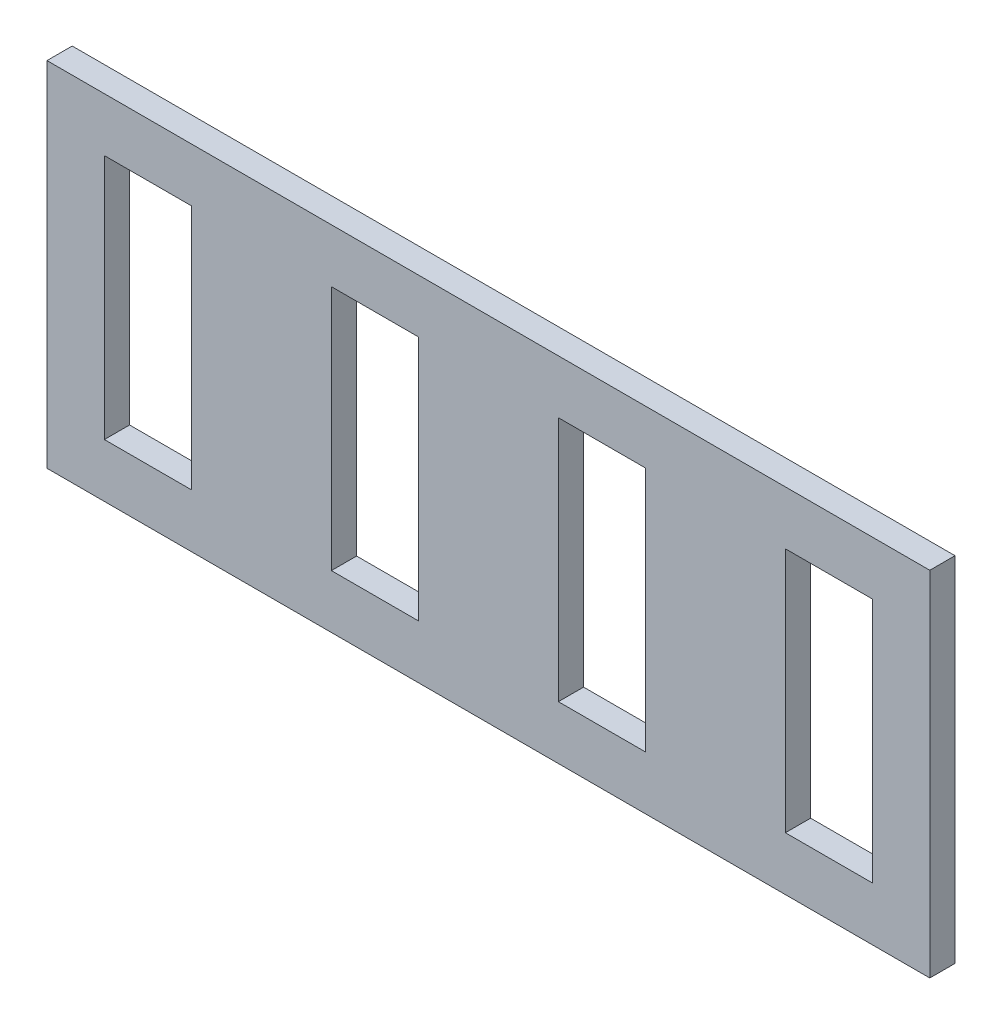
ISO-10303-21;
HEADER;
FILE_DESCRIPTION(('STEP AP214'),'2;1');
FILE_NAME('part.step','',(''),(''),'','','');
FILE_SCHEMA(('AUTOMOTIVE_DESIGN { 1 0 10303 214 1 1 1 1 }'));
ENDSEC;
DATA;
#1=APPLICATION_CONTEXT('core data for automotive mechanical design processes');
#2=APPLICATION_PROTOCOL_DEFINITION('international standard','automotive_design',2000,#1);
#3=PRODUCT_CONTEXT('',#1,'mechanical');
#4=PRODUCT('Part','Part','',(#3));
#5=PRODUCT_RELATED_PRODUCT_CATEGORY('part','',(#4));
#6=PRODUCT_DEFINITION_FORMATION('','',#4);
#7=PRODUCT_DEFINITION_CONTEXT('part definition',#1,'design');
#8=PRODUCT_DEFINITION('design','',#6,#7);
#9=PRODUCT_DEFINITION_SHAPE('','',#8);
#10=(LENGTH_UNIT() NAMED_UNIT(*) SI_UNIT(.MILLI.,.METRE.));
#11=(NAMED_UNIT(*) PLANE_ANGLE_UNIT() SI_UNIT($,.RADIAN.));
#12=(NAMED_UNIT(*) SI_UNIT($,.STERADIAN.) SOLID_ANGLE_UNIT());
#13=UNCERTAINTY_MEASURE_WITH_UNIT(LENGTH_MEASURE(1.E-05),#10,'distance_accuracy_value','');
#14=(GEOMETRIC_REPRESENTATION_CONTEXT(3) GLOBAL_UNCERTAINTY_ASSIGNED_CONTEXT((#13)) GLOBAL_UNIT_ASSIGNED_CONTEXT((#10,
#11,#12)) REPRESENTATION_CONTEXT('',''));
#15=CARTESIAN_POINT('',(0.,0.,0.));
#16=DIRECTION('',(0.,0.,1.));
#17=DIRECTION('',(1.,0.,0.));
#18=AXIS2_PLACEMENT_3D('',#15,#16,#17);
#19=CARTESIAN_POINT('',(0.,0.,20.));
#20=DIRECTION('',(0.,0.,-1.));
#21=DIRECTION('',(-1.,0.,0.));
#22=AXIS2_PLACEMENT_3D('',#19,#20,#21);
#23=PLANE('',#22);
#24=DIRECTION('',(1.,0.,0.));
#25=VECTOR('',#24,1.);
#26=CARTESIAN_POINT('',(130.5,-97.4999999999999,20.));
#27=LINE('',#26,#25);
#28=CARTESIAN_POINT('',(130.5,-97.4999999999999,20.));
#29=VERTEX_POINT('',#28);
#30=CARTESIAN_POINT('',(199.5,-97.4999999999999,20.));
#31=VERTEX_POINT('',#30);
#32=EDGE_CURVE('E216',#29,#31,#27,.T.);
#33=ORIENTED_EDGE('',*,*,#32,.F.);
#34=DIRECTION('',(0.,-1.,0.));
#35=VECTOR('',#34,1.);
#36=CARTESIAN_POINT('',(130.5,97.5000000000001,20.));
#37=LINE('',#36,#35);
#38=CARTESIAN_POINT('',(130.5,97.5000000000001,20.));
#39=VERTEX_POINT('',#38);
#40=EDGE_CURVE('E224',#39,#29,#37,.T.);
#41=ORIENTED_EDGE('',*,*,#40,.F.);
#42=DIRECTION('',(-1.,0.,0.));
#43=VECTOR('',#42,1.);
#44=CARTESIAN_POINT('',(130.5,97.5000000000001,20.));
#45=LINE('',#44,#43);
#46=CARTESIAN_POINT('',(199.5,97.5000000000001,20.));
#47=VERTEX_POINT('',#46);
#48=EDGE_CURVE('E221',#47,#39,#45,.T.);
#49=ORIENTED_EDGE('',*,*,#48,.F.);
#50=DIRECTION('',(0.,1.,0.));
#51=VECTOR('',#50,1.);
#52=CARTESIAN_POINT('',(199.5,97.5000000000001,20.));
#53=LINE('',#52,#51);
#54=EDGE_CURVE('E218',#31,#47,#53,.T.);
#55=ORIENTED_EDGE('',*,*,#54,.F.);
#56=EDGE_LOOP('',(#33,#41,#49,#55));
#57=FACE_BOUND('',#56,.T.);
#58=DIRECTION('',(0.,1.,0.));
#59=VECTOR('',#58,1.);
#60=CARTESIAN_POINT('',(-340.5,97.4999999999999,20.));
#61=LINE('',#60,#59);
#62=CARTESIAN_POINT('',(-340.5,-97.5000000000002,20.));
#63=VERTEX_POINT('',#62);
#64=CARTESIAN_POINT('',(-340.5,97.4999999999999,20.));
#65=VERTEX_POINT('',#64);
#66=EDGE_CURVE('E278',#63,#65,#61,.T.);
#67=ORIENTED_EDGE('',*,*,#66,.F.);
#68=DIRECTION('',(1.,0.,0.));
#69=VECTOR('',#68,1.);
#70=CARTESIAN_POINT('',(-409.5,-97.5000000000002,20.));
#71=LINE('',#70,#69);
#72=CARTESIAN_POINT('',(-409.5,-97.5000000000002,20.));
#73=VERTEX_POINT('',#72);
#74=EDGE_CURVE('E286',#73,#63,#71,.T.);
#75=ORIENTED_EDGE('',*,*,#74,.F.);
#76=DIRECTION('',(0.,-1.,0.));
#77=VECTOR('',#76,1.);
#78=CARTESIAN_POINT('',(-409.5,97.4999999999998,20.));
#79=LINE('',#78,#77);
#80=CARTESIAN_POINT('',(-409.5,97.4999999999998,20.));
#81=VERTEX_POINT('',#80);
#82=EDGE_CURVE('E283',#81,#73,#79,.T.);
#83=ORIENTED_EDGE('',*,*,#82,.F.);
#84=DIRECTION('',(-1.,0.,0.));
#85=VECTOR('',#84,1.);
#86=CARTESIAN_POINT('',(-409.5,97.4999999999998,20.));
#87=LINE('',#86,#85);
#88=EDGE_CURVE('E280',#65,#81,#87,.T.);
#89=ORIENTED_EDGE('',*,*,#88,.F.);
#90=EDGE_LOOP('',(#67,#75,#83,#89));
#91=FACE_BOUND('',#90,.T.);
#92=DIRECTION('',(0.,-1.,0.));
#93=VECTOR('',#92,1.);
#94=CARTESIAN_POINT('',(-455.,-140.,20.));
#95=LINE('',#94,#93);
#96=CARTESIAN_POINT('',(-455.,140.,20.));
#97=VERTEX_POINT('',#96);
#98=CARTESIAN_POINT('',(-455.,-140.,20.));
#99=VERTEX_POINT('',#98);
#100=EDGE_CURVE('E309',#97,#99,#95,.T.);
#101=ORIENTED_EDGE('',*,*,#100,.T.);
#102=DIRECTION('',(1.,0.,0.));
#103=VECTOR('',#102,1.);
#104=CARTESIAN_POINT('',(245.,-140.,20.));
#105=LINE('',#104,#103);
#106=CARTESIAN_POINT('',(245.,-140.,20.));
#107=VERTEX_POINT('',#106);
#108=EDGE_CURVE('E312',#99,#107,#105,.T.);
#109=ORIENTED_EDGE('',*,*,#108,.T.);
#110=DIRECTION('',(0.,1.,0.));
#111=VECTOR('',#110,1.);
#112=CARTESIAN_POINT('',(245.,140.,20.));
#113=LINE('',#112,#111);
#114=CARTESIAN_POINT('',(245.,140.,20.));
#115=VERTEX_POINT('',#114);
#116=EDGE_CURVE('E315',#107,#115,#113,.T.);
#117=ORIENTED_EDGE('',*,*,#116,.T.);
#118=DIRECTION('',(-1.,0.,0.));
#119=VECTOR('',#118,1.);
#120=CARTESIAN_POINT('',(-455.,140.,20.));
#121=LINE('',#120,#119);
#122=EDGE_CURVE('E317',#115,#97,#121,.T.);
#123=ORIENTED_EDGE('',*,*,#122,.T.);
#124=EDGE_LOOP('',(#101,#109,#117,#123));
#125=FACE_BOUND('',#124,.T.);
#126=DIRECTION('',(1.,0.,0.));
#127=VECTOR('',#126,1.);
#128=CARTESIAN_POINT('',(-229.5,-97.4999999999999,20.));
#129=LINE('',#128,#127);
#130=CARTESIAN_POINT('',(-229.5,-97.4999999999999,20.));
#131=VERTEX_POINT('',#130);
#132=CARTESIAN_POINT('',(-160.5,-97.4999999999999,20.));
#133=VERTEX_POINT('',#132);
#134=EDGE_CURVE('E247',#131,#133,#129,.T.);
#135=ORIENTED_EDGE('',*,*,#134,.F.);
#136=DIRECTION('',(0.,-1.,0.));
#137=VECTOR('',#136,1.);
#138=CARTESIAN_POINT('',(-229.5,97.5000000000001,20.));
#139=LINE('',#138,#137);
#140=CARTESIAN_POINT('',(-229.5,97.5000000000001,20.));
#141=VERTEX_POINT('',#140);
#142=EDGE_CURVE('E255',#141,#131,#139,.T.);
#143=ORIENTED_EDGE('',*,*,#142,.F.);
#144=DIRECTION('',(-1.,0.,0.));
#145=VECTOR('',#144,1.);
#146=CARTESIAN_POINT('',(-229.5,97.5000000000001,20.));
#147=LINE('',#146,#145);
#148=CARTESIAN_POINT('',(-160.5,97.5000000000001,20.));
#149=VERTEX_POINT('',#148);
#150=EDGE_CURVE('E252',#149,#141,#147,.T.);
#151=ORIENTED_EDGE('',*,*,#150,.F.);
#152=DIRECTION('',(0.,1.,0.));
#153=VECTOR('',#152,1.);
#154=CARTESIAN_POINT('',(-160.5,97.5000000000001,20.));
#155=LINE('',#154,#153);
#156=EDGE_CURVE('E249',#133,#149,#155,.T.);
#157=ORIENTED_EDGE('',*,*,#156,.F.);
#158=EDGE_LOOP('',(#135,#143,#151,#157));
#159=FACE_BOUND('',#158,.T.);
#160=DIRECTION('',(1.,0.,0.));
#161=VECTOR('',#160,1.);
#162=CARTESIAN_POINT('',(-49.5,-97.4999999999999,20.));
#163=LINE('',#162,#161);
#164=CARTESIAN_POINT('',(-49.5,-97.4999999999999,20.));
#165=VERTEX_POINT('',#164);
#166=CARTESIAN_POINT('',(19.5,-97.4999999999999,20.));
#167=VERTEX_POINT('',#166);
#168=EDGE_CURVE('E180',#165,#167,#163,.T.);
#169=ORIENTED_EDGE('',*,*,#168,.F.);
#170=DIRECTION('',(0.,-1.,0.));
#171=VECTOR('',#170,1.);
#172=CARTESIAN_POINT('',(-49.5,97.5000000000001,20.));
#173=LINE('',#172,#171);
#174=CARTESIAN_POINT('',(-49.5,97.5000000000001,20.));
#175=VERTEX_POINT('',#174);
#176=EDGE_CURVE('E202',#175,#165,#173,.T.);
#177=ORIENTED_EDGE('',*,*,#176,.F.);
#178=DIRECTION('',(-1.,0.,0.));
#179=VECTOR('',#178,1.);
#180=CARTESIAN_POINT('',(-49.5,97.5000000000001,20.));
#181=LINE('',#180,#179);
#182=CARTESIAN_POINT('',(19.5,97.5000000000001,20.));
#183=VERTEX_POINT('',#182);
#184=EDGE_CURVE('E200',#183,#175,#181,.T.);
#185=ORIENTED_EDGE('',*,*,#184,.F.);
#186=DIRECTION('',(0.,1.,0.));
#187=VECTOR('',#186,1.);
#188=CARTESIAN_POINT('',(19.5,97.5000000000001,20.));
#189=LINE('',#188,#187);
#190=EDGE_CURVE('E188',#167,#183,#189,.T.);
#191=ORIENTED_EDGE('',*,*,#190,.F.);
#192=EDGE_LOOP('',(#169,#177,#185,#191));
#193=FACE_BOUND('',#192,.T.);
#194=ADVANCED_FACE('F43',(#57,#91,#125,#159,#193),#23,.F.);
#195=CARTESIAN_POINT('',(0.,0.,0.));
#196=DIRECTION('',(0.,0.,-1.));
#197=DIRECTION('',(-1.,0.,0.));
#198=AXIS2_PLACEMENT_3D('',#195,#196,#197);
#199=PLANE('',#198);
#200=DIRECTION('',(0.,-1.,0.));
#201=VECTOR('',#200,1.);
#202=CARTESIAN_POINT('',(-455.,-140.,0.));
#203=LINE('',#202,#201);
#204=CARTESIAN_POINT('',(-455.,140.,0.));
#205=VERTEX_POINT('',#204);
#206=CARTESIAN_POINT('',(-455.,-140.,0.));
#207=VERTEX_POINT('',#206);
#208=EDGE_CURVE('E308',#205,#207,#203,.T.);
#209=ORIENTED_EDGE('',*,*,#208,.F.);
#210=DIRECTION('',(-1.,0.,0.));
#211=VECTOR('',#210,1.);
#212=CARTESIAN_POINT('',(-455.,140.,0.));
#213=LINE('',#212,#211);
#214=CARTESIAN_POINT('',(245.,140.,0.));
#215=VERTEX_POINT('',#214);
#216=EDGE_CURVE('E313',#215,#205,#213,.T.);
#217=ORIENTED_EDGE('',*,*,#216,.F.);
#218=DIRECTION('',(0.,1.,0.));
#219=VECTOR('',#218,1.);
#220=CARTESIAN_POINT('',(245.,140.,0.));
#221=LINE('',#220,#219);
#222=CARTESIAN_POINT('',(245.,-140.,0.));
#223=VERTEX_POINT('',#222);
#224=EDGE_CURVE('E324',#223,#215,#221,.T.);
#225=ORIENTED_EDGE('',*,*,#224,.F.);
#226=DIRECTION('',(1.,0.,0.));
#227=VECTOR('',#226,1.);
#228=CARTESIAN_POINT('',(245.,-140.,0.));
#229=LINE('',#228,#227);
#230=EDGE_CURVE('E322',#207,#223,#229,.T.);
#231=ORIENTED_EDGE('',*,*,#230,.F.);
#232=EDGE_LOOP('',(#209,#217,#225,#231));
#233=FACE_BOUND('',#232,.T.);
#234=DIRECTION('',(1.,0.,0.));
#235=VECTOR('',#234,1.);
#236=CARTESIAN_POINT('',(-409.5,-97.5000000000002,0.));
#237=LINE('',#236,#235);
#238=CARTESIAN_POINT('',(-409.5,-97.5000000000002,0.));
#239=VERTEX_POINT('',#238);
#240=CARTESIAN_POINT('',(-340.5,-97.5000000000002,0.));
#241=VERTEX_POINT('',#240);
#242=EDGE_CURVE('E281',#239,#241,#237,.T.);
#243=ORIENTED_EDGE('',*,*,#242,.T.);
#244=DIRECTION('',(0.,1.,0.));
#245=VECTOR('',#244,1.);
#246=CARTESIAN_POINT('',(-340.5,97.4999999999999,0.));
#247=LINE('',#246,#245);
#248=CARTESIAN_POINT('',(-340.5,97.4999999999999,0.));
#249=VERTEX_POINT('',#248);
#250=EDGE_CURVE('E277',#241,#249,#247,.T.);
#251=ORIENTED_EDGE('',*,*,#250,.T.);
#252=DIRECTION('',(-1.,0.,0.));
#253=VECTOR('',#252,1.);
#254=CARTESIAN_POINT('',(-409.5,97.4999999999998,0.));
#255=LINE('',#254,#253);
#256=CARTESIAN_POINT('',(-409.5,97.4999999999998,0.));
#257=VERTEX_POINT('',#256);
#258=EDGE_CURVE('E291',#249,#257,#255,.T.);
#259=ORIENTED_EDGE('',*,*,#258,.T.);
#260=DIRECTION('',(0.,-1.,0.));
#261=VECTOR('',#260,1.);
#262=CARTESIAN_POINT('',(-409.5,97.4999999999998,0.));
#263=LINE('',#262,#261);
#264=EDGE_CURVE('E294',#257,#239,#263,.T.);
#265=ORIENTED_EDGE('',*,*,#264,.T.);
#266=EDGE_LOOP('',(#243,#251,#259,#265));
#267=FACE_BOUND('',#266,.T.);
#268=DIRECTION('',(0.,-1.,0.));
#269=VECTOR('',#268,1.);
#270=CARTESIAN_POINT('',(-229.5,97.5000000000001,0.));
#271=LINE('',#270,#269);
#272=CARTESIAN_POINT('',(-229.5,97.5000000000001,0.));
#273=VERTEX_POINT('',#272);
#274=CARTESIAN_POINT('',(-229.5,-97.4999999999999,0.));
#275=VERTEX_POINT('',#274);
#276=EDGE_CURVE('E250',#273,#275,#271,.T.);
#277=ORIENTED_EDGE('',*,*,#276,.T.);
#278=DIRECTION('',(1.,0.,0.));
#279=VECTOR('',#278,1.);
#280=CARTESIAN_POINT('',(-229.5,-97.4999999999999,0.));
#281=LINE('',#280,#279);
#282=CARTESIAN_POINT('',(-160.5,-97.4999999999999,0.));
#283=VERTEX_POINT('',#282);
#284=EDGE_CURVE('E246',#275,#283,#281,.T.);
#285=ORIENTED_EDGE('',*,*,#284,.T.);
#286=DIRECTION('',(0.,1.,0.));
#287=VECTOR('',#286,1.);
#288=CARTESIAN_POINT('',(-160.5,97.5000000000001,0.));
#289=LINE('',#288,#287);
#290=CARTESIAN_POINT('',(-160.5,97.5000000000001,0.));
#291=VERTEX_POINT('',#290);
#292=EDGE_CURVE('E260',#283,#291,#289,.T.);
#293=ORIENTED_EDGE('',*,*,#292,.T.);
#294=DIRECTION('',(-1.,0.,0.));
#295=VECTOR('',#294,1.);
#296=CARTESIAN_POINT('',(-229.5,97.5000000000001,0.));
#297=LINE('',#296,#295);
#298=EDGE_CURVE('E263',#291,#273,#297,.T.);
#299=ORIENTED_EDGE('',*,*,#298,.T.);
#300=EDGE_LOOP('',(#277,#285,#293,#299));
#301=FACE_BOUND('',#300,.T.);
#302=DIRECTION('',(0.,-1.,0.));
#303=VECTOR('',#302,1.);
#304=CARTESIAN_POINT('',(130.5,97.5000000000001,0.));
#305=LINE('',#304,#303);
#306=CARTESIAN_POINT('',(130.5,97.5000000000001,0.));
#307=VERTEX_POINT('',#306);
#308=CARTESIAN_POINT('',(130.5,-97.4999999999999,0.));
#309=VERTEX_POINT('',#308);
#310=EDGE_CURVE('E219',#307,#309,#305,.T.);
#311=ORIENTED_EDGE('',*,*,#310,.T.);
#312=DIRECTION('',(1.,0.,0.));
#313=VECTOR('',#312,1.);
#314=CARTESIAN_POINT('',(130.5,-97.4999999999999,0.));
#315=LINE('',#314,#313);
#316=CARTESIAN_POINT('',(199.5,-97.4999999999999,0.));
#317=VERTEX_POINT('',#316);
#318=EDGE_CURVE('E196',#309,#317,#315,.T.);
#319=ORIENTED_EDGE('',*,*,#318,.T.);
#320=DIRECTION('',(0.,1.,0.));
#321=VECTOR('',#320,1.);
#322=CARTESIAN_POINT('',(199.5,97.5000000000001,0.));
#323=LINE('',#322,#321);
#324=CARTESIAN_POINT('',(199.5,97.5000000000001,0.));
#325=VERTEX_POINT('',#324);
#326=EDGE_CURVE('E229',#317,#325,#323,.T.);
#327=ORIENTED_EDGE('',*,*,#326,.T.);
#328=DIRECTION('',(-1.,0.,0.));
#329=VECTOR('',#328,1.);
#330=CARTESIAN_POINT('',(130.5,97.5000000000001,0.));
#331=LINE('',#330,#329);
#332=EDGE_CURVE('E232',#325,#307,#331,.T.);
#333=ORIENTED_EDGE('',*,*,#332,.T.);
#334=EDGE_LOOP('',(#311,#319,#327,#333));
#335=FACE_BOUND('',#334,.T.);
#336=DIRECTION('',(0.,-1.,0.));
#337=VECTOR('',#336,1.);
#338=CARTESIAN_POINT('',(-49.5,97.5000000000001,0.));
#339=LINE('',#338,#337);
#340=CARTESIAN_POINT('',(-49.5,97.5000000000001,0.));
#341=VERTEX_POINT('',#340);
#342=CARTESIAN_POINT('',(-49.5,-97.4999999999999,0.));
#343=VERTEX_POINT('',#342);
#344=EDGE_CURVE('E189',#341,#343,#339,.T.);
#345=ORIENTED_EDGE('',*,*,#344,.T.);
#346=DIRECTION('',(1.,0.,0.));
#347=VECTOR('',#346,1.);
#348=CARTESIAN_POINT('',(-49.5,-97.4999999999999,0.));
#349=LINE('',#348,#347);
#350=CARTESIAN_POINT('',(19.5,-97.4999999999999,0.));
#351=VERTEX_POINT('',#350);
#352=EDGE_CURVE('E66',#343,#351,#349,.T.);
#353=ORIENTED_EDGE('',*,*,#352,.T.);
#354=DIRECTION('',(0.,1.,0.));
#355=VECTOR('',#354,1.);
#356=CARTESIAN_POINT('',(19.5,97.5000000000001,0.));
#357=LINE('',#356,#355);
#358=CARTESIAN_POINT('',(19.5,97.5000000000001,0.));
#359=VERTEX_POINT('',#358);
#360=EDGE_CURVE('E195',#351,#359,#357,.T.);
#361=ORIENTED_EDGE('',*,*,#360,.T.);
#362=DIRECTION('',(-1.,0.,0.));
#363=VECTOR('',#362,1.);
#364=CARTESIAN_POINT('',(-49.5,97.5000000000001,0.));
#365=LINE('',#364,#363);
#366=EDGE_CURVE('E208',#359,#341,#365,.T.);
#367=ORIENTED_EDGE('',*,*,#366,.T.);
#368=EDGE_LOOP('',(#345,#353,#361,#367));
#369=FACE_BOUND('',#368,.T.);
#370=ADVANCED_FACE('F342',(#233,#267,#301,#335,#369),#199,.T.);
#371=CARTESIAN_POINT('',(-455.,-140.,20.));
#372=DIRECTION('',(1.,0.,0.));
#373=DIRECTION('',(0.,1.,0.));
#374=AXIS2_PLACEMENT_3D('',#371,#372,#373);
#375=PLANE('',#374);
#376=ORIENTED_EDGE('',*,*,#208,.T.);
#377=DIRECTION('',(0.,0.,-1.));
#378=VECTOR('',#377,1.);
#379=CARTESIAN_POINT('',(-455.,-140.,20.));
#380=LINE('',#379,#378);
#381=EDGE_CURVE('E11',#99,#207,#380,.T.);
#382=ORIENTED_EDGE('',*,*,#381,.F.);
#383=ORIENTED_EDGE('',*,*,#100,.F.);
#384=DIRECTION('',(0.,0.,-1.));
#385=VECTOR('',#384,1.);
#386=CARTESIAN_POINT('',(-455.,140.,20.));
#387=LINE('',#386,#385);
#388=EDGE_CURVE('E319',#97,#205,#387,.T.);
#389=ORIENTED_EDGE('',*,*,#388,.T.);
#390=EDGE_LOOP('',(#376,#382,#383,#389));
#391=FACE_BOUND('',#390,.T.);
#392=ADVANCED_FACE('F45',(#391),#375,.F.);
#393=CARTESIAN_POINT('',(245.,-140.,20.));
#394=DIRECTION('',(0.,1.,0.));
#395=DIRECTION('',(-1.,0.,0.));
#396=AXIS2_PLACEMENT_3D('',#393,#394,#395);
#397=PLANE('',#396);
#398=ORIENTED_EDGE('',*,*,#230,.T.);
#399=DIRECTION('',(0.,0.,-1.));
#400=VECTOR('',#399,1.);
#401=CARTESIAN_POINT('',(245.,-140.,20.));
#402=LINE('',#401,#400);
#403=EDGE_CURVE('E51',#107,#223,#402,.T.);
#404=ORIENTED_EDGE('',*,*,#403,.F.);
#405=ORIENTED_EDGE('',*,*,#108,.F.);
#406=ORIENTED_EDGE('',*,*,#381,.T.);
#407=EDGE_LOOP('',(#398,#404,#405,#406));
#408=FACE_BOUND('',#407,.T.);
#409=ADVANCED_FACE('F353',(#408),#397,.F.);
#410=CARTESIAN_POINT('',(245.,140.,20.));
#411=DIRECTION('',(-1.,0.,0.));
#412=DIRECTION('',(0.,-1.,0.));
#413=AXIS2_PLACEMENT_3D('',#410,#411,#412);
#414=PLANE('',#413);
#415=ORIENTED_EDGE('',*,*,#224,.T.);
#416=DIRECTION('',(0.,0.,-1.));
#417=VECTOR('',#416,1.);
#418=CARTESIAN_POINT('',(245.,140.,20.));
#419=LINE('',#418,#417);
#420=EDGE_CURVE('E329',#115,#215,#419,.T.);
#421=ORIENTED_EDGE('',*,*,#420,.F.);
#422=ORIENTED_EDGE('',*,*,#116,.F.);
#423=ORIENTED_EDGE('',*,*,#403,.T.);
#424=EDGE_LOOP('',(#415,#421,#422,#423));
#425=FACE_BOUND('',#424,.T.);
#426=ADVANCED_FACE('F336',(#425),#414,.F.);
#427=CARTESIAN_POINT('',(-455.,140.,20.));
#428=DIRECTION('',(0.,-1.,0.));
#429=DIRECTION('',(0.,0.,-1.));
#430=AXIS2_PLACEMENT_3D('',#427,#428,#429);
#431=PLANE('',#430);
#432=ORIENTED_EDGE('',*,*,#216,.T.);
#433=ORIENTED_EDGE('',*,*,#388,.F.);
#434=ORIENTED_EDGE('',*,*,#122,.F.);
#435=ORIENTED_EDGE('',*,*,#420,.T.);
#436=EDGE_LOOP('',(#432,#433,#434,#435));
#437=FACE_BOUND('',#436,.T.);
#438=ADVANCED_FACE('F346',(#437),#431,.F.);
#439=CARTESIAN_POINT('',(-340.5,97.4999999999999,20.));
#440=DIRECTION('',(-1.,0.,0.));
#441=DIRECTION('',(0.,-1.,0.));
#442=AXIS2_PLACEMENT_3D('',#439,#440,#441);
#443=PLANE('',#442);
#444=ORIENTED_EDGE('',*,*,#250,.F.);
#445=DIRECTION('',(0.,0.,-1.));
#446=VECTOR('',#445,1.);
#447=CARTESIAN_POINT('',(-340.5,-97.5000000000002,20.));
#448=LINE('',#447,#446);
#449=EDGE_CURVE('E288',#63,#241,#448,.T.);
#450=ORIENTED_EDGE('',*,*,#449,.F.);
#451=ORIENTED_EDGE('',*,*,#66,.T.);
#452=DIRECTION('',(0.,0.,-1.));
#453=VECTOR('',#452,1.);
#454=CARTESIAN_POINT('',(-340.5,97.4999999999999,20.));
#455=LINE('',#454,#453);
#456=EDGE_CURVE('E305',#65,#249,#455,.T.);
#457=ORIENTED_EDGE('',*,*,#456,.T.);
#458=EDGE_LOOP('',(#444,#450,#451,#457));
#459=FACE_BOUND('',#458,.T.);
#460=ADVANCED_FACE('F370',(#459),#443,.T.);
#461=CARTESIAN_POINT('',(-409.5,97.4999999999998,20.));
#462=DIRECTION('',(0.,-1.,0.));
#463=DIRECTION('',(1.,0.,0.));
#464=AXIS2_PLACEMENT_3D('',#461,#462,#463);
#465=PLANE('',#464);
#466=ORIENTED_EDGE('',*,*,#258,.F.);
#467=ORIENTED_EDGE('',*,*,#456,.F.);
#468=ORIENTED_EDGE('',*,*,#88,.T.);
#469=DIRECTION('',(0.,0.,-1.));
#470=VECTOR('',#469,1.);
#471=CARTESIAN_POINT('',(-409.5,97.4999999999998,20.));
#472=LINE('',#471,#470);
#473=EDGE_CURVE('E303',#81,#257,#472,.T.);
#474=ORIENTED_EDGE('',*,*,#473,.T.);
#475=EDGE_LOOP('',(#466,#467,#468,#474));
#476=FACE_BOUND('',#475,.T.);
#477=ADVANCED_FACE('F377',(#476),#465,.T.);
#478=CARTESIAN_POINT('',(-409.5,97.4999999999998,20.));
#479=DIRECTION('',(1.,0.,0.));
#480=DIRECTION('',(0.,0.,-1.));
#481=AXIS2_PLACEMENT_3D('',#478,#479,#480);
#482=PLANE('',#481);
#483=ORIENTED_EDGE('',*,*,#264,.F.);
#484=ORIENTED_EDGE('',*,*,#473,.F.);
#485=ORIENTED_EDGE('',*,*,#82,.T.);
#486=DIRECTION('',(0.,0.,-1.));
#487=VECTOR('',#486,1.);
#488=CARTESIAN_POINT('',(-409.5,-97.5000000000002,20.));
#489=LINE('',#488,#487);
#490=EDGE_CURVE('E301',#73,#239,#489,.T.);
#491=ORIENTED_EDGE('',*,*,#490,.T.);
#492=EDGE_LOOP('',(#483,#484,#485,#491));
#493=FACE_BOUND('',#492,.T.);
#494=ADVANCED_FACE('F382',(#493),#482,.T.);
#495=CARTESIAN_POINT('',(-409.5,-97.5000000000002,20.));
#496=DIRECTION('',(0.,1.,0.));
#497=DIRECTION('',(-1.,0.,0.));
#498=AXIS2_PLACEMENT_3D('',#495,#496,#497);
#499=PLANE('',#498);
#500=ORIENTED_EDGE('',*,*,#242,.F.);
#501=ORIENTED_EDGE('',*,*,#490,.F.);
#502=ORIENTED_EDGE('',*,*,#74,.T.);
#503=ORIENTED_EDGE('',*,*,#449,.T.);
#504=EDGE_LOOP('',(#500,#501,#502,#503));
#505=FACE_BOUND('',#504,.T.);
#506=ADVANCED_FACE('F389',(#505),#499,.T.);
#507=CARTESIAN_POINT('',(-229.5,-97.4999999999999,20.));
#508=DIRECTION('',(0.,1.,0.));
#509=DIRECTION('',(-1.,0.,0.));
#510=AXIS2_PLACEMENT_3D('',#507,#508,#509);
#511=PLANE('',#510);
#512=ORIENTED_EDGE('',*,*,#284,.F.);
#513=DIRECTION('',(0.,0.,-1.));
#514=VECTOR('',#513,1.);
#515=CARTESIAN_POINT('',(-229.5,-97.4999999999999,20.));
#516=LINE('',#515,#514);
#517=EDGE_CURVE('E257',#131,#275,#516,.T.);
#518=ORIENTED_EDGE('',*,*,#517,.F.);
#519=ORIENTED_EDGE('',*,*,#134,.T.);
#520=DIRECTION('',(0.,0.,-1.));
#521=VECTOR('',#520,1.);
#522=CARTESIAN_POINT('',(-160.5,-97.4999999999999,20.));
#523=LINE('',#522,#521);
#524=EDGE_CURVE('E274',#133,#283,#523,.T.);
#525=ORIENTED_EDGE('',*,*,#524,.T.);
#526=EDGE_LOOP('',(#512,#518,#519,#525));
#527=FACE_BOUND('',#526,.T.);
#528=ADVANCED_FACE('F402',(#527),#511,.T.);
#529=CARTESIAN_POINT('',(-160.5,97.5000000000001,20.));
#530=DIRECTION('',(-1.,0.,0.));
#531=DIRECTION('',(0.,-1.,0.));
#532=AXIS2_PLACEMENT_3D('',#529,#530,#531);
#533=PLANE('',#532);
#534=ORIENTED_EDGE('',*,*,#292,.F.);
#535=ORIENTED_EDGE('',*,*,#524,.F.);
#536=ORIENTED_EDGE('',*,*,#156,.T.);
#537=DIRECTION('',(0.,0.,-1.));
#538=VECTOR('',#537,1.);
#539=CARTESIAN_POINT('',(-160.5,97.5000000000001,20.));
#540=LINE('',#539,#538);
#541=EDGE_CURVE('E272',#149,#291,#540,.T.);
#542=ORIENTED_EDGE('',*,*,#541,.T.);
#543=EDGE_LOOP('',(#534,#535,#536,#542));
#544=FACE_BOUND('',#543,.T.);
#545=ADVANCED_FACE('F407',(#544),#533,.T.);
#546=CARTESIAN_POINT('',(-229.5,97.5000000000001,20.));
#547=DIRECTION('',(0.,-1.,0.));
#548=DIRECTION('',(1.,0.,0.));
#549=AXIS2_PLACEMENT_3D('',#546,#547,#548);
#550=PLANE('',#549);
#551=ORIENTED_EDGE('',*,*,#298,.F.);
#552=ORIENTED_EDGE('',*,*,#541,.F.);
#553=ORIENTED_EDGE('',*,*,#150,.T.);
#554=DIRECTION('',(0.,0.,-1.));
#555=VECTOR('',#554,1.);
#556=CARTESIAN_POINT('',(-229.5,97.5000000000001,20.));
#557=LINE('',#556,#555);
#558=EDGE_CURVE('E270',#141,#273,#557,.T.);
#559=ORIENTED_EDGE('',*,*,#558,.T.);
#560=EDGE_LOOP('',(#551,#552,#553,#559));
#561=FACE_BOUND('',#560,.T.);
#562=ADVANCED_FACE('F411',(#561),#550,.T.);
#563=CARTESIAN_POINT('',(-229.5,97.5000000000001,20.));
#564=DIRECTION('',(1.,0.,0.));
#565=DIRECTION('',(0.,0.,-1.));
#566=AXIS2_PLACEMENT_3D('',#563,#564,#565);
#567=PLANE('',#566);
#568=ORIENTED_EDGE('',*,*,#276,.F.);
#569=ORIENTED_EDGE('',*,*,#558,.F.);
#570=ORIENTED_EDGE('',*,*,#142,.T.);
#571=ORIENTED_EDGE('',*,*,#517,.T.);
#572=EDGE_LOOP('',(#568,#569,#570,#571));
#573=FACE_BOUND('',#572,.T.);
#574=ADVANCED_FACE('F415',(#573),#567,.T.);
#575=CARTESIAN_POINT('',(130.5,-97.4999999999999,20.));
#576=DIRECTION('',(0.,1.,0.));
#577=DIRECTION('',(-1.,0.,0.));
#578=AXIS2_PLACEMENT_3D('',#575,#576,#577);
#579=PLANE('',#578);
#580=ORIENTED_EDGE('',*,*,#318,.F.);
#581=DIRECTION('',(0.,0.,-1.));
#582=VECTOR('',#581,1.);
#583=CARTESIAN_POINT('',(130.5,-97.4999999999999,20.));
#584=LINE('',#583,#582);
#585=EDGE_CURVE('E226',#29,#309,#584,.T.);
#586=ORIENTED_EDGE('',*,*,#585,.F.);
#587=ORIENTED_EDGE('',*,*,#32,.T.);
#588=DIRECTION('',(0.,0.,-1.));
#589=VECTOR('',#588,1.);
#590=CARTESIAN_POINT('',(199.5,-97.4999999999999,20.));
#591=LINE('',#590,#589);
#592=EDGE_CURVE('E243',#31,#317,#591,.T.);
#593=ORIENTED_EDGE('',*,*,#592,.T.);
#594=EDGE_LOOP('',(#580,#586,#587,#593));
#595=FACE_BOUND('',#594,.T.);
#596=ADVANCED_FACE('F419',(#595),#579,.T.);
#597=CARTESIAN_POINT('',(199.5,97.5000000000001,20.));
#598=DIRECTION('',(-1.,0.,0.));
#599=DIRECTION('',(0.,-1.,0.));
#600=AXIS2_PLACEMENT_3D('',#597,#598,#599);
#601=PLANE('',#600);
#602=ORIENTED_EDGE('',*,*,#326,.F.);
#603=ORIENTED_EDGE('',*,*,#592,.F.);
#604=ORIENTED_EDGE('',*,*,#54,.T.);
#605=DIRECTION('',(0.,0.,-1.));
#606=VECTOR('',#605,1.);
#607=CARTESIAN_POINT('',(199.5,97.5000000000001,20.));
#608=LINE('',#607,#606);
#609=EDGE_CURVE('E241',#47,#325,#608,.T.);
#610=ORIENTED_EDGE('',*,*,#609,.T.);
#611=EDGE_LOOP('',(#602,#603,#604,#610));
#612=FACE_BOUND('',#611,.T.);
#613=ADVANCED_FACE('F423',(#612),#601,.T.);
#614=CARTESIAN_POINT('',(130.5,97.5000000000001,20.));
#615=DIRECTION('',(0.,-1.,0.));
#616=DIRECTION('',(1.,0.,0.));
#617=AXIS2_PLACEMENT_3D('',#614,#615,#616);
#618=PLANE('',#617);
#619=ORIENTED_EDGE('',*,*,#332,.F.);
#620=ORIENTED_EDGE('',*,*,#609,.F.);
#621=ORIENTED_EDGE('',*,*,#48,.T.);
#622=DIRECTION('',(0.,0.,-1.));
#623=VECTOR('',#622,1.);
#624=CARTESIAN_POINT('',(130.5,97.5000000000001,20.));
#625=LINE('',#624,#623);
#626=EDGE_CURVE('E239',#39,#307,#625,.T.);
#627=ORIENTED_EDGE('',*,*,#626,.T.);
#628=EDGE_LOOP('',(#619,#620,#621,#627));
#629=FACE_BOUND('',#628,.T.);
#630=ADVANCED_FACE('F427',(#629),#618,.T.);
#631=CARTESIAN_POINT('',(130.5,97.5000000000001,20.));
#632=DIRECTION('',(1.,0.,0.));
#633=DIRECTION('',(0.,0.,-1.));
#634=AXIS2_PLACEMENT_3D('',#631,#632,#633);
#635=PLANE('',#634);
#636=ORIENTED_EDGE('',*,*,#310,.F.);
#637=ORIENTED_EDGE('',*,*,#626,.F.);
#638=ORIENTED_EDGE('',*,*,#40,.T.);
#639=ORIENTED_EDGE('',*,*,#585,.T.);
#640=EDGE_LOOP('',(#636,#637,#638,#639));
#641=FACE_BOUND('',#640,.T.);
#642=ADVANCED_FACE('F431',(#641),#635,.T.);
#643=CARTESIAN_POINT('',(-49.5,-97.4999999999999,20.));
#644=DIRECTION('',(0.,1.,0.));
#645=DIRECTION('',(-1.,0.,0.));
#646=AXIS2_PLACEMENT_3D('',#643,#644,#645);
#647=PLANE('',#646);
#648=ORIENTED_EDGE('',*,*,#352,.F.);
#649=DIRECTION('',(0.,0.,-1.));
#650=VECTOR('',#649,1.);
#651=CARTESIAN_POINT('',(-49.5,-97.4999999999999,20.));
#652=LINE('',#651,#650);
#653=EDGE_CURVE('E184',#165,#343,#652,.T.);
#654=ORIENTED_EDGE('',*,*,#653,.F.);
#655=ORIENTED_EDGE('',*,*,#168,.T.);
#656=DIRECTION('',(0.,0.,-1.));
#657=VECTOR('',#656,1.);
#658=CARTESIAN_POINT('',(19.5,-97.4999999999999,20.));
#659=LINE('',#658,#657);
#660=EDGE_CURVE('E183',#167,#351,#659,.T.);
#661=ORIENTED_EDGE('',*,*,#660,.T.);
#662=EDGE_LOOP('',(#648,#654,#655,#661));
#663=FACE_BOUND('',#662,.T.);
#664=ADVANCED_FACE('F182',(#663),#647,.T.);
#665=CARTESIAN_POINT('',(19.5,97.5000000000001,20.));
#666=DIRECTION('',(-1.,0.,0.));
#667=DIRECTION('',(0.,-1.,0.));
#668=AXIS2_PLACEMENT_3D('',#665,#666,#667);
#669=PLANE('',#668);
#670=ORIENTED_EDGE('',*,*,#360,.F.);
#671=ORIENTED_EDGE('',*,*,#660,.F.);
#672=ORIENTED_EDGE('',*,*,#190,.T.);
#673=DIRECTION('',(0.,0.,-1.));
#674=VECTOR('',#673,1.);
#675=CARTESIAN_POINT('',(19.5,97.5000000000001,20.));
#676=LINE('',#675,#674);
#677=EDGE_CURVE('E197',#183,#359,#676,.T.);
#678=ORIENTED_EDGE('',*,*,#677,.T.);
#679=EDGE_LOOP('',(#670,#671,#672,#678));
#680=FACE_BOUND('',#679,.T.);
#681=ADVANCED_FACE('F192',(#680),#669,.T.);
#682=CARTESIAN_POINT('',(-49.5,97.5000000000001,20.));
#683=DIRECTION('',(0.,-1.,0.));
#684=DIRECTION('',(1.,0.,0.));
#685=AXIS2_PLACEMENT_3D('',#682,#683,#684);
#686=PLANE('',#685);
#687=ORIENTED_EDGE('',*,*,#366,.F.);
#688=ORIENTED_EDGE('',*,*,#677,.F.);
#689=ORIENTED_EDGE('',*,*,#184,.T.);
#690=DIRECTION('',(0.,0.,-1.));
#691=VECTOR('',#690,1.);
#692=CARTESIAN_POINT('',(-49.5,97.5000000000001,20.));
#693=LINE('',#692,#691);
#694=EDGE_CURVE('E58',#175,#341,#693,.T.);
#695=ORIENTED_EDGE('',*,*,#694,.T.);
#696=EDGE_LOOP('',(#687,#688,#689,#695));
#697=FACE_BOUND('',#696,.T.);
#698=ADVANCED_FACE('F440',(#697),#686,.T.);
#699=CARTESIAN_POINT('',(-49.5,97.5000000000001,20.));
#700=DIRECTION('',(1.,0.,0.));
#701=DIRECTION('',(0.,0.,-1.));
#702=AXIS2_PLACEMENT_3D('',#699,#700,#701);
#703=PLANE('',#702);
#704=ORIENTED_EDGE('',*,*,#344,.F.);
#705=ORIENTED_EDGE('',*,*,#694,.F.);
#706=ORIENTED_EDGE('',*,*,#176,.T.);
#707=ORIENTED_EDGE('',*,*,#653,.T.);
#708=EDGE_LOOP('',(#704,#705,#706,#707));
#709=FACE_BOUND('',#708,.T.);
#710=ADVANCED_FACE('F443',(#709),#703,.T.);
#711=CLOSED_SHELL('',(#194,#370,#392,#409,#426,#438,#460,#477,#494,#506,#528,#545,#562,#574,
#596,#613,#630,#642,#664,#681,#698,#710));
#712=MANIFOLD_SOLID_BREP('B2',#711);
#713=ADVANCED_BREP_SHAPE_REPRESENTATION('',(#18,#712),#14);
#714=SHAPE_DEFINITION_REPRESENTATION(#9,#713);
ENDSEC;
END-ISO-10303-21;
